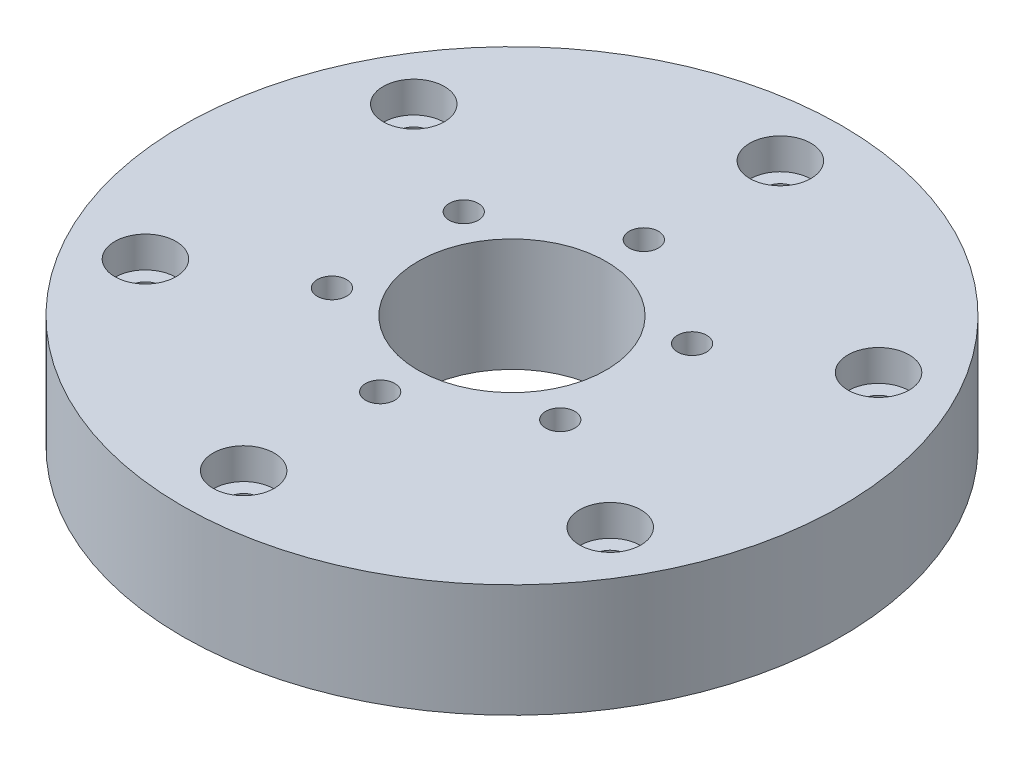
ISO-10303-21;
HEADER;
FILE_DESCRIPTION(('STEP AP214'),'2;1');
FILE_NAME('part.step','',(''),(''),'','','');
FILE_SCHEMA(('AUTOMOTIVE_DESIGN { 1 0 10303 214 1 1 1 1 }'));
ENDSEC;
DATA;
#1=APPLICATION_CONTEXT('core data for automotive mechanical design processes');
#2=APPLICATION_PROTOCOL_DEFINITION('international standard','automotive_design',2000,#1);
#3=PRODUCT_CONTEXT('',#1,'mechanical');
#4=PRODUCT('Part','Part','',(#3));
#5=PRODUCT_RELATED_PRODUCT_CATEGORY('part','',(#4));
#6=PRODUCT_DEFINITION_FORMATION('','',#4);
#7=PRODUCT_DEFINITION_CONTEXT('part definition',#1,'design');
#8=PRODUCT_DEFINITION('design','',#6,#7);
#9=PRODUCT_DEFINITION_SHAPE('','',#8);
#10=(LENGTH_UNIT() NAMED_UNIT(*) SI_UNIT(.MILLI.,.METRE.));
#11=(NAMED_UNIT(*) PLANE_ANGLE_UNIT() SI_UNIT($,.RADIAN.));
#12=(NAMED_UNIT(*) SI_UNIT($,.STERADIAN.) SOLID_ANGLE_UNIT());
#13=UNCERTAINTY_MEASURE_WITH_UNIT(LENGTH_MEASURE(1.E-05),#10,'distance_accuracy_value','');
#14=(GEOMETRIC_REPRESENTATION_CONTEXT(3) GLOBAL_UNCERTAINTY_ASSIGNED_CONTEXT((#13)) GLOBAL_UNIT_ASSIGNED_CONTEXT((#10,
#11,#12)) REPRESENTATION_CONTEXT('',''));
#15=CARTESIAN_POINT('',(0.,0.,0.));
#16=DIRECTION('',(0.,0.,1.));
#17=DIRECTION('',(1.,0.,0.));
#18=AXIS2_PLACEMENT_3D('',#15,#16,#17);
#19=CARTESIAN_POINT('',(0.,12.,-28.5));
#20=DIRECTION('',(0.,-1.,0.));
#21=DIRECTION('',(0.,0.,-1.));
#22=AXIS2_PLACEMENT_3D('',#19,#20,#21);
#23=CYLINDRICAL_SURFACE('',#22,1.7);
#24=CARTESIAN_POINT('',(0.,0.,-28.5));
#25=DIRECTION('',(0.,1.,0.));
#26=DIRECTION('',(0.,0.,1.));
#27=AXIS2_PLACEMENT_3D('',#24,#25,#26);
#28=CIRCLE('',#27,1.7);
#29=CARTESIAN_POINT('',(0.,0.,-26.8));
#30=VERTEX_POINT('',#29);
#31=EDGE_CURVE('E146',#30,#30,#28,.T.);
#32=ORIENTED_EDGE('',*,*,#31,.F.);
#33=EDGE_LOOP('',(#32));
#34=FACE_BOUND('',#33,.T.);
#35=CARTESIAN_POINT('',(0.,8.7,-28.5));
#36=DIRECTION('',(0.,1.,0.));
#37=DIRECTION('',(0.,0.,1.));
#38=AXIS2_PLACEMENT_3D('',#35,#36,#37);
#39=CIRCLE('',#38,1.7);
#40=CARTESIAN_POINT('',(0.,8.7,-26.8));
#41=VERTEX_POINT('',#40);
#42=EDGE_CURVE('E41',#41,#41,#39,.T.);
#43=ORIENTED_EDGE('',*,*,#42,.T.);
#44=EDGE_LOOP('',(#43));
#45=FACE_BOUND('',#44,.T.);
#46=ADVANCED_FACE('F37',(#34,#45),#23,.F.);
#47=CARTESIAN_POINT('',(24.6817240078571,12.,-14.2500000000011));
#48=DIRECTION('',(0.,-1.,0.));
#49=DIRECTION('',(0.,0.,-1.));
#50=AXIS2_PLACEMENT_3D('',#47,#48,#49);
#51=CYLINDRICAL_SURFACE('',#50,1.70000000000034);
#52=CARTESIAN_POINT('',(24.6817240078571,0.,-14.2500000000011));
#53=DIRECTION('',(0.,1.,0.));
#54=DIRECTION('',(0.,0.,1.));
#55=AXIS2_PLACEMENT_3D('',#52,#53,#54);
#56=CIRCLE('',#55,1.70000000000034);
#57=CARTESIAN_POINT('',(24.6817240078571,0.,-12.5500000000007));
#58=VERTEX_POINT('',#57);
#59=EDGE_CURVE('E105',#58,#58,#56,.T.);
#60=ORIENTED_EDGE('',*,*,#59,.F.);
#61=EDGE_LOOP('',(#60));
#62=FACE_BOUND('',#61,.T.);
#63=CARTESIAN_POINT('',(24.6817240078571,8.7,-14.2500000000011));
#64=DIRECTION('',(0.,1.,0.));
#65=DIRECTION('',(0.,0.,1.));
#66=AXIS2_PLACEMENT_3D('',#63,#64,#65);
#67=CIRCLE('',#66,1.70000000000034);
#68=CARTESIAN_POINT('',(24.6817240078571,8.7,-12.5500000000007));
#69=VERTEX_POINT('',#68);
#70=EDGE_CURVE('E74',#69,#69,#67,.T.);
#71=ORIENTED_EDGE('',*,*,#70,.T.);
#72=EDGE_LOOP('',(#71));
#73=FACE_BOUND('',#72,.T.);
#74=ADVANCED_FACE('F185',(#62,#73),#51,.F.);
#75=CARTESIAN_POINT('',(24.6817240078583,12.,14.2499999999989));
#76=DIRECTION('',(0.,-1.,0.));
#77=DIRECTION('',(0.,0.,-1.));
#78=AXIS2_PLACEMENT_3D('',#75,#76,#77);
#79=CYLINDRICAL_SURFACE('',#78,1.70000000000156);
#80=CARTESIAN_POINT('',(24.6817240078583,0.,14.2499999999989));
#81=DIRECTION('',(0.,1.,0.));
#82=DIRECTION('',(0.,0.,1.));
#83=AXIS2_PLACEMENT_3D('',#80,#81,#82);
#84=CIRCLE('',#83,1.70000000000156);
#85=CARTESIAN_POINT('',(24.6817240078583,0.,15.9500000000005));
#86=VERTEX_POINT('',#85);
#87=EDGE_CURVE('E101',#86,#86,#84,.T.);
#88=ORIENTED_EDGE('',*,*,#87,.F.);
#89=EDGE_LOOP('',(#88));
#90=FACE_BOUND('',#89,.T.);
#91=CARTESIAN_POINT('',(24.6817240078583,8.7,14.2499999999989));
#92=DIRECTION('',(0.,1.,0.));
#93=DIRECTION('',(0.,0.,1.));
#94=AXIS2_PLACEMENT_3D('',#91,#92,#93);
#95=CIRCLE('',#94,1.70000000000156);
#96=CARTESIAN_POINT('',(24.6817240078583,8.7,15.9500000000005));
#97=VERTEX_POINT('',#96);
#98=EDGE_CURVE('E71',#97,#97,#95,.T.);
#99=ORIENTED_EDGE('',*,*,#98,.T.);
#100=EDGE_LOOP('',(#99));
#101=FACE_BOUND('',#100,.T.);
#102=ADVANCED_FACE('F191',(#90,#101),#79,.F.);
#103=CARTESIAN_POINT('',(2.41958542616683E-12,12.,28.5));
#104=DIRECTION('',(0.,-1.,0.));
#105=DIRECTION('',(0.,0.,-1.));
#106=AXIS2_PLACEMENT_3D('',#103,#104,#105);
#107=CYLINDRICAL_SURFACE('',#106,1.7000000000025);
#108=CARTESIAN_POINT('',(2.41958542616683E-12,0.,28.5));
#109=DIRECTION('',(0.,1.,0.));
#110=DIRECTION('',(0.,0.,1.));
#111=AXIS2_PLACEMENT_3D('',#108,#109,#110);
#112=CIRCLE('',#111,1.7000000000025);
#113=CARTESIAN_POINT('',(2.41958542616683E-12,0.,30.2000000000025));
#114=VERTEX_POINT('',#113);
#115=EDGE_CURVE('E92',#114,#114,#112,.T.);
#116=ORIENTED_EDGE('',*,*,#115,.F.);
#117=EDGE_LOOP('',(#116));
#118=FACE_BOUND('',#117,.T.);
#119=CARTESIAN_POINT('',(2.41958542616683E-12,8.7,28.5));
#120=DIRECTION('',(0.,1.,0.));
#121=DIRECTION('',(0.,0.,1.));
#122=AXIS2_PLACEMENT_3D('',#119,#120,#121);
#123=CIRCLE('',#122,1.7000000000025);
#124=CARTESIAN_POINT('',(2.41958542616683E-12,8.7,30.2000000000025));
#125=VERTEX_POINT('',#124);
#126=EDGE_CURVE('E67',#125,#125,#123,.T.);
#127=ORIENTED_EDGE('',*,*,#126,.T.);
#128=EDGE_LOOP('',(#127));
#129=FACE_BOUND('',#128,.T.);
#130=ADVANCED_FACE('F218',(#118,#129),#107,.F.);
#131=CARTESIAN_POINT('',(-24.6817240078547,12.,14.2500000000011));
#132=DIRECTION('',(0.,-1.,0.));
#133=DIRECTION('',(0.,0.,-1.));
#134=AXIS2_PLACEMENT_3D('',#131,#132,#133);
#135=CYLINDRICAL_SURFACE('',#134,1.7000000000023);
#136=CARTESIAN_POINT('',(-24.6817240078547,0.,14.2500000000011));
#137=DIRECTION('',(0.,1.,0.));
#138=DIRECTION('',(0.,0.,1.));
#139=AXIS2_PLACEMENT_3D('',#136,#137,#138);
#140=CIRCLE('',#139,1.7000000000023);
#141=CARTESIAN_POINT('',(-24.6817240078547,0.,15.9500000000034));
#142=VERTEX_POINT('',#141);
#143=EDGE_CURVE('E86',#142,#142,#140,.T.);
#144=ORIENTED_EDGE('',*,*,#143,.F.);
#145=EDGE_LOOP('',(#144));
#146=FACE_BOUND('',#145,.T.);
#147=CARTESIAN_POINT('',(-24.6817240078547,8.7,14.2500000000011));
#148=DIRECTION('',(0.,1.,0.));
#149=DIRECTION('',(0.,0.,1.));
#150=AXIS2_PLACEMENT_3D('',#147,#148,#149);
#151=CIRCLE('',#150,1.7000000000023);
#152=CARTESIAN_POINT('',(-24.6817240078547,8.7,15.9500000000034));
#153=VERTEX_POINT('',#152);
#154=EDGE_CURVE('E62',#153,#153,#151,.T.);
#155=ORIENTED_EDGE('',*,*,#154,.T.);
#156=EDGE_LOOP('',(#155));
#157=FACE_BOUND('',#156,.T.);
#158=ADVANCED_FACE('F222',(#146,#157),#135,.F.);
#159=CARTESIAN_POINT('',(-24.6817240078559,12.,-14.2499999999989));
#160=DIRECTION('',(0.,-1.,0.));
#161=DIRECTION('',(0.,0.,-1.));
#162=AXIS2_PLACEMENT_3D('',#159,#160,#161);
#163=CYLINDRICAL_SURFACE('',#162,1.70000000000122);
#164=CARTESIAN_POINT('',(-24.6817240078559,0.,-14.2499999999989));
#165=DIRECTION('',(0.,1.,0.));
#166=DIRECTION('',(0.,0.,1.));
#167=AXIS2_PLACEMENT_3D('',#164,#165,#166);
#168=CIRCLE('',#167,1.70000000000122);
#169=CARTESIAN_POINT('',(-24.6817240078559,0.,-12.5499999999977));
#170=VERTEX_POINT('',#169);
#171=EDGE_CURVE('E81',#170,#170,#168,.T.);
#172=ORIENTED_EDGE('',*,*,#171,.F.);
#173=EDGE_LOOP('',(#172));
#174=FACE_BOUND('',#173,.T.);
#175=CARTESIAN_POINT('',(-24.6817240078559,8.7,-14.2499999999989));
#176=DIRECTION('',(0.,1.,0.));
#177=DIRECTION('',(0.,0.,1.));
#178=AXIS2_PLACEMENT_3D('',#175,#176,#177);
#179=CIRCLE('',#178,1.70000000000122);
#180=CARTESIAN_POINT('',(-24.6817240078559,8.7,-12.5499999999977));
#181=VERTEX_POINT('',#180);
#182=EDGE_CURVE('E58',#181,#181,#179,.T.);
#183=ORIENTED_EDGE('',*,*,#182,.T.);
#184=EDGE_LOOP('',(#183));
#185=FACE_BOUND('',#184,.T.);
#186=ADVANCED_FACE('F226',(#174,#185),#163,.F.);
#187=CARTESIAN_POINT('',(0.,12.,0.));
#188=DIRECTION('',(0.,1.,0.));
#189=DIRECTION('',(0.,0.,1.));
#190=AXIS2_PLACEMENT_3D('',#187,#188,#189);
#191=PLANE('',#190);
#192=CARTESIAN_POINT('',(0.,12.,-28.500000000001));
#193=DIRECTION('',(0.,1.,0.));
#194=DIRECTION('',(0.,0.,1.));
#195=AXIS2_PLACEMENT_3D('',#192,#193,#194);
#196=CIRCLE('',#195,3.25);
#197=CARTESIAN_POINT('',(0.,12.,-25.250000000001));
#198=VERTEX_POINT('',#197);
#199=EDGE_CURVE('E284',#198,#198,#196,.T.);
#200=ORIENTED_EDGE('',*,*,#199,.F.);
#201=EDGE_LOOP('',(#200));
#202=FACE_BOUND('',#201,.T.);
#203=CARTESIAN_POINT('',(-24.6817240078568,12.,-14.2499999999995));
#204=DIRECTION('',(0.,1.,0.));
#205=DIRECTION('',(0.,0.,1.));
#206=AXIS2_PLACEMENT_3D('',#203,#204,#205);
#207=CIRCLE('',#206,3.25000000000122);
#208=CARTESIAN_POINT('',(-24.6817240078568,12.,-10.9999999999982));
#209=VERTEX_POINT('',#208);
#210=EDGE_CURVE('E295',#209,#209,#207,.T.);
#211=ORIENTED_EDGE('',*,*,#210,.F.);
#212=EDGE_LOOP('',(#211));
#213=FACE_BOUND('',#212,.T.);
#214=CARTESIAN_POINT('',(-24.6817240078556,12.,14.2500000000016));
#215=DIRECTION('',(0.,1.,0.));
#216=DIRECTION('',(0.,0.,1.));
#217=AXIS2_PLACEMENT_3D('',#214,#215,#216);
#218=CIRCLE('',#217,3.2500000000023);
#219=CARTESIAN_POINT('',(-24.6817240078556,12.,17.5000000000039));
#220=VERTEX_POINT('',#219);
#221=EDGE_CURVE('E95',#220,#220,#218,.T.);
#222=ORIENTED_EDGE('',*,*,#221,.F.);
#223=EDGE_LOOP('',(#222));
#224=FACE_BOUND('',#223,.T.);
#225=CARTESIAN_POINT('',(2.41958542616692E-12,12.,28.500000000001));
#226=DIRECTION('',(0.,1.,0.));
#227=DIRECTION('',(0.,0.,1.));
#228=AXIS2_PLACEMENT_3D('',#225,#226,#227);
#229=CIRCLE('',#228,3.2500000000025);
#230=CARTESIAN_POINT('',(2.41958542616692E-12,12.,31.7500000000036));
#231=VERTEX_POINT('',#230);
#232=EDGE_CURVE('E318',#231,#231,#229,.T.);
#233=ORIENTED_EDGE('',*,*,#232,.F.);
#234=EDGE_LOOP('',(#233));
#235=FACE_BOUND('',#234,.T.);
#236=CARTESIAN_POINT('',(24.6817240078592,12.,14.2499999999995));
#237=DIRECTION('',(0.,1.,0.));
#238=DIRECTION('',(0.,0.,1.));
#239=AXIS2_PLACEMENT_3D('',#236,#237,#238);
#240=CIRCLE('',#239,3.25000000000156);
#241=CARTESIAN_POINT('',(24.6817240078592,12.,17.500000000001));
#242=VERTEX_POINT('',#241);
#243=EDGE_CURVE('E310',#242,#242,#240,.T.);
#244=ORIENTED_EDGE('',*,*,#243,.F.);
#245=EDGE_LOOP('',(#244));
#246=FACE_BOUND('',#245,.T.);
#247=CARTESIAN_POINT('',(24.681724007858,12.,-14.2500000000016));
#248=DIRECTION('',(0.,1.,0.));
#249=DIRECTION('',(0.,0.,1.));
#250=AXIS2_PLACEMENT_3D('',#247,#248,#249);
#251=CIRCLE('',#250,3.25000000000034);
#252=CARTESIAN_POINT('',(24.681724007858,12.,-11.0000000000012));
#253=VERTEX_POINT('',#252);
#254=EDGE_CURVE('E302',#253,#253,#251,.T.);
#255=ORIENTED_EDGE('',*,*,#254,.F.);
#256=EDGE_LOOP('',(#255));
#257=FACE_BOUND('',#256,.T.);
#258=CARTESIAN_POINT('',(-12.1243556529821,12.,-7.00000000000014));
#259=DIRECTION('',(0.,1.,0.));
#260=DIRECTION('',(0.,0.,1.));
#261=AXIS2_PLACEMENT_3D('',#258,#259,#260);
#262=CIRCLE('',#261,1.55);
#263=CARTESIAN_POINT('',(-12.1243556529821,12.,-5.45000000000014));
#264=VERTEX_POINT('',#263);
#265=EDGE_CURVE('E110',#264,#264,#262,.T.);
#266=ORIENTED_EDGE('',*,*,#265,.F.);
#267=EDGE_LOOP('',(#266));
#268=FACE_BOUND('',#267,.T.);
#269=CARTESIAN_POINT('',(7.90664347494893E-13,12.,14.));
#270=DIRECTION('',(0.,1.,0.));
#271=DIRECTION('',(0.,0.,1.));
#272=AXIS2_PLACEMENT_3D('',#269,#270,#271);
#273=CIRCLE('',#272,1.55000000000085);
#274=CARTESIAN_POINT('',(7.90664347494893E-13,12.,15.5500000000008));
#275=VERTEX_POINT('',#274);
#276=EDGE_CURVE('E126',#275,#275,#273,.T.);
#277=ORIENTED_EDGE('',*,*,#276,.F.);
#278=EDGE_LOOP('',(#277));
#279=FACE_BOUND('',#278,.T.);
#280=CARTESIAN_POINT('',(12.1243556529822,12.,-6.99999999999997));
#281=DIRECTION('',(0.,1.,0.));
#282=DIRECTION('',(0.,0.,1.));
#283=AXIS2_PLACEMENT_3D('',#280,#281,#282);
#284=CIRCLE('',#283,1.55);
#285=CARTESIAN_POINT('',(12.1243556529822,12.,-5.44999999999997));
#286=VERTEX_POINT('',#285);
#287=EDGE_CURVE('E142',#286,#286,#284,.T.);
#288=ORIENTED_EDGE('',*,*,#287,.F.);
#289=EDGE_LOOP('',(#288));
#290=FACE_BOUND('',#289,.T.);
#291=CARTESIAN_POINT('',(0.,12.,-14.));
#292=DIRECTION('',(0.,1.,0.));
#293=DIRECTION('',(0.,0.,1.));
#294=AXIS2_PLACEMENT_3D('',#291,#292,#293);
#295=CIRCLE('',#294,1.55);
#296=CARTESIAN_POINT('',(0.,12.,-12.45));
#297=VERTEX_POINT('',#296);
#298=EDGE_CURVE('E154',#297,#297,#295,.T.);
#299=ORIENTED_EDGE('',*,*,#298,.F.);
#300=EDGE_LOOP('',(#299));
#301=FACE_BOUND('',#300,.T.);
#302=CARTESIAN_POINT('',(0.,12.,0.));
#303=DIRECTION('',(0.,1.,0.));
#304=DIRECTION('',(0.,0.,1.));
#305=AXIS2_PLACEMENT_3D('',#302,#303,#304);
#306=CIRCLE('',#305,35.);
#307=CARTESIAN_POINT('',(0.,12.,35.));
#308=VERTEX_POINT('',#307);
#309=EDGE_CURVE('E10',#308,#308,#306,.T.);
#310=ORIENTED_EDGE('',*,*,#309,.T.);
#311=EDGE_LOOP('',(#310));
#312=FACE_BOUND('',#311,.T.);
#313=CARTESIAN_POINT('',(0.,12.,0.));
#314=DIRECTION('',(0.,1.,0.));
#315=DIRECTION('',(0.,0.,1.));
#316=AXIS2_PLACEMENT_3D('',#313,#314,#315);
#317=CIRCLE('',#316,10.);
#318=CARTESIAN_POINT('',(0.,12.,10.));
#319=VERTEX_POINT('',#318);
#320=EDGE_CURVE('E52',#319,#319,#317,.T.);
#321=ORIENTED_EDGE('',*,*,#320,.F.);
#322=EDGE_LOOP('',(#321));
#323=FACE_BOUND('',#322,.T.);
#324=CARTESIAN_POINT('',(12.1243556529821,12.,7.00000000000006));
#325=DIRECTION('',(0.,1.,0.));
#326=DIRECTION('',(0.,0.,1.));
#327=AXIS2_PLACEMENT_3D('',#324,#325,#326);
#328=CIRCLE('',#327,1.55);
#329=CARTESIAN_POINT('',(12.1243556529821,12.,8.55000000000006));
#330=VERTEX_POINT('',#329);
#331=EDGE_CURVE('E134',#330,#330,#328,.T.);
#332=ORIENTED_EDGE('',*,*,#331,.F.);
#333=EDGE_LOOP('',(#332));
#334=FACE_BOUND('',#333,.T.);
#335=CARTESIAN_POINT('',(-12.1243556529815,12.,7.00000000000035));
#336=DIRECTION('',(0.,1.,0.));
#337=DIRECTION('',(0.,0.,1.));
#338=AXIS2_PLACEMENT_3D('',#335,#336,#337);
#339=CIRCLE('',#338,1.5500000000008);
#340=CARTESIAN_POINT('',(-12.1243556529815,12.,8.55000000000115));
#341=VERTEX_POINT('',#340);
#342=EDGE_CURVE('E118',#341,#341,#339,.T.);
#343=ORIENTED_EDGE('',*,*,#342,.F.);
#344=EDGE_LOOP('',(#343));
#345=FACE_BOUND('',#344,.T.);
#346=ADVANCED_FACE('F230',(#202,#213,#224,#235,#246,#257,#268,#279,#290,#301,#312,#323,#334,
#345),#191,.T.);
#347=CARTESIAN_POINT('',(0.,0.,0.));
#348=DIRECTION('',(0.,1.,0.));
#349=DIRECTION('',(0.,0.,1.));
#350=AXIS2_PLACEMENT_3D('',#347,#348,#349);
#351=PLANE('',#350);
#352=CARTESIAN_POINT('',(0.,0.,0.));
#353=DIRECTION('',(0.,1.,0.));
#354=DIRECTION('',(0.,0.,1.));
#355=AXIS2_PLACEMENT_3D('',#352,#353,#354);
#356=CIRCLE('',#355,35.);
#357=CARTESIAN_POINT('',(0.,0.,35.));
#358=VERTEX_POINT('',#357);
#359=EDGE_CURVE('E46',#358,#358,#356,.T.);
#360=ORIENTED_EDGE('',*,*,#359,.F.);
#361=EDGE_LOOP('',(#360));
#362=FACE_BOUND('',#361,.T.);
#363=CARTESIAN_POINT('',(0.,0.,0.));
#364=DIRECTION('',(0.,1.,0.));
#365=DIRECTION('',(0.,0.,1.));
#366=AXIS2_PLACEMENT_3D('',#363,#364,#365);
#367=CIRCLE('',#366,10.);
#368=CARTESIAN_POINT('',(0.,0.,10.));
#369=VERTEX_POINT('',#368);
#370=EDGE_CURVE('E55',#369,#369,#367,.T.);
#371=ORIENTED_EDGE('',*,*,#370,.T.);
#372=EDGE_LOOP('',(#371));
#373=FACE_BOUND('',#372,.T.);
#374=CARTESIAN_POINT('',(0.,0.,-14.));
#375=DIRECTION('',(0.,1.,0.));
#376=DIRECTION('',(0.,0.,1.));
#377=AXIS2_PLACEMENT_3D('',#374,#375,#376);
#378=CIRCLE('',#377,1.55);
#379=CARTESIAN_POINT('',(0.,0.,-12.45));
#380=VERTEX_POINT('',#379);
#381=EDGE_CURVE('E153',#380,#380,#378,.T.);
#382=ORIENTED_EDGE('',*,*,#381,.T.);
#383=EDGE_LOOP('',(#382));
#384=FACE_BOUND('',#383,.T.);
#385=ORIENTED_EDGE('',*,*,#31,.T.);
#386=EDGE_LOOP('',(#385));
#387=FACE_BOUND('',#386,.T.);
#388=CARTESIAN_POINT('',(12.1243556529822,0.,-6.99999999999997));
#389=DIRECTION('',(0.,1.,0.));
#390=DIRECTION('',(0.,0.,1.));
#391=AXIS2_PLACEMENT_3D('',#388,#389,#390);
#392=CIRCLE('',#391,1.55);
#393=CARTESIAN_POINT('',(12.1243556529822,0.,-5.44999999999997));
#394=VERTEX_POINT('',#393);
#395=EDGE_CURVE('E138',#394,#394,#392,.T.);
#396=ORIENTED_EDGE('',*,*,#395,.T.);
#397=EDGE_LOOP('',(#396));
#398=FACE_BOUND('',#397,.T.);
#399=CARTESIAN_POINT('',(12.1243556529821,0.,7.00000000000006));
#400=DIRECTION('',(0.,1.,0.));
#401=DIRECTION('',(0.,0.,1.));
#402=AXIS2_PLACEMENT_3D('',#399,#400,#401);
#403=CIRCLE('',#402,1.55);
#404=CARTESIAN_POINT('',(12.1243556529821,0.,8.55000000000006));
#405=VERTEX_POINT('',#404);
#406=EDGE_CURVE('E130',#405,#405,#403,.T.);
#407=ORIENTED_EDGE('',*,*,#406,.T.);
#408=EDGE_LOOP('',(#407));
#409=FACE_BOUND('',#408,.T.);
#410=CARTESIAN_POINT('',(7.90664347494893E-13,0.,14.));
#411=DIRECTION('',(0.,1.,0.));
#412=DIRECTION('',(0.,0.,1.));
#413=AXIS2_PLACEMENT_3D('',#410,#411,#412);
#414=CIRCLE('',#413,1.55000000000085);
#415=CARTESIAN_POINT('',(7.90664347494893E-13,0.,15.5500000000008));
#416=VERTEX_POINT('',#415);
#417=EDGE_CURVE('E122',#416,#416,#414,.T.);
#418=ORIENTED_EDGE('',*,*,#417,.T.);
#419=EDGE_LOOP('',(#418));
#420=FACE_BOUND('',#419,.T.);
#421=CARTESIAN_POINT('',(-12.1243556529815,0.,7.00000000000035));
#422=DIRECTION('',(0.,1.,0.));
#423=DIRECTION('',(0.,0.,1.));
#424=AXIS2_PLACEMENT_3D('',#421,#422,#423);
#425=CIRCLE('',#424,1.5500000000008);
#426=CARTESIAN_POINT('',(-12.1243556529815,0.,8.55000000000115));
#427=VERTEX_POINT('',#426);
#428=EDGE_CURVE('E114',#427,#427,#425,.T.);
#429=ORIENTED_EDGE('',*,*,#428,.T.);
#430=EDGE_LOOP('',(#429));
#431=FACE_BOUND('',#430,.T.);
#432=CARTESIAN_POINT('',(-12.1243556529821,0.,-7.00000000000014));
#433=DIRECTION('',(0.,1.,0.));
#434=DIRECTION('',(0.,0.,1.));
#435=AXIS2_PLACEMENT_3D('',#432,#433,#434);
#436=CIRCLE('',#435,1.55);
#437=CARTESIAN_POINT('',(-12.1243556529821,0.,-5.45000000000014));
#438=VERTEX_POINT('',#437);
#439=EDGE_CURVE('E109',#438,#438,#436,.T.);
#440=ORIENTED_EDGE('',*,*,#439,.T.);
#441=EDGE_LOOP('',(#440));
#442=FACE_BOUND('',#441,.T.);
#443=ORIENTED_EDGE('',*,*,#59,.T.);
#444=EDGE_LOOP('',(#443));
#445=FACE_BOUND('',#444,.T.);
#446=ORIENTED_EDGE('',*,*,#87,.T.);
#447=EDGE_LOOP('',(#446));
#448=FACE_BOUND('',#447,.T.);
#449=ORIENTED_EDGE('',*,*,#115,.T.);
#450=EDGE_LOOP('',(#449));
#451=FACE_BOUND('',#450,.T.);
#452=ORIENTED_EDGE('',*,*,#143,.T.);
#453=EDGE_LOOP('',(#452));
#454=FACE_BOUND('',#453,.T.);
#455=ORIENTED_EDGE('',*,*,#171,.T.);
#456=EDGE_LOOP('',(#455));
#457=FACE_BOUND('',#456,.T.);
#458=ADVANCED_FACE('F168',(#362,#373,#384,#387,#398,#409,#420,#431,#442,#445,#448,#451,#454,
#457),#351,.F.);
#459=CARTESIAN_POINT('',(0.,12.,0.));
#460=DIRECTION('',(0.,-1.,0.));
#461=DIRECTION('',(0.,0.,-1.));
#462=AXIS2_PLACEMENT_3D('',#459,#460,#461);
#463=CYLINDRICAL_SURFACE('',#462,35.);
#464=ORIENTED_EDGE('',*,*,#309,.F.);
#465=EDGE_LOOP('',(#464));
#466=FACE_BOUND('',#465,.T.);
#467=ORIENTED_EDGE('',*,*,#359,.T.);
#468=EDGE_LOOP('',(#467));
#469=FACE_BOUND('',#468,.T.);
#470=ADVANCED_FACE('F39',(#466,#469),#463,.T.);
#471=CARTESIAN_POINT('',(0.,12.,0.));
#472=DIRECTION('',(0.,-1.,0.));
#473=DIRECTION('',(0.,0.,-1.));
#474=AXIS2_PLACEMENT_3D('',#471,#472,#473);
#475=CYLINDRICAL_SURFACE('',#474,10.);
#476=ORIENTED_EDGE('',*,*,#320,.T.);
#477=EDGE_LOOP('',(#476));
#478=FACE_BOUND('',#477,.T.);
#479=ORIENTED_EDGE('',*,*,#370,.F.);
#480=EDGE_LOOP('',(#479));
#481=FACE_BOUND('',#480,.T.);
#482=ADVANCED_FACE('F171',(#478,#481),#475,.F.);
#483=CARTESIAN_POINT('',(0.,12.,-14.));
#484=DIRECTION('',(0.,-1.,0.));
#485=DIRECTION('',(0.,0.,-1.));
#486=AXIS2_PLACEMENT_3D('',#483,#484,#485);
#487=CYLINDRICAL_SURFACE('',#486,1.55);
#488=ORIENTED_EDGE('',*,*,#298,.T.);
#489=EDGE_LOOP('',(#488));
#490=FACE_BOUND('',#489,.T.);
#491=ORIENTED_EDGE('',*,*,#381,.F.);
#492=EDGE_LOOP('',(#491));
#493=FACE_BOUND('',#492,.T.);
#494=ADVANCED_FACE('F173',(#490,#493),#487,.F.);
#495=CARTESIAN_POINT('',(12.1243556529822,12.,-6.99999999999997));
#496=DIRECTION('',(0.,-1.,0.));
#497=DIRECTION('',(0.,0.,-1.));
#498=AXIS2_PLACEMENT_3D('',#495,#496,#497);
#499=CYLINDRICAL_SURFACE('',#498,1.55);
#500=ORIENTED_EDGE('',*,*,#287,.T.);
#501=EDGE_LOOP('',(#500));
#502=FACE_BOUND('',#501,.T.);
#503=ORIENTED_EDGE('',*,*,#395,.F.);
#504=EDGE_LOOP('',(#503));
#505=FACE_BOUND('',#504,.T.);
#506=ADVANCED_FACE('F179',(#502,#505),#499,.F.);
#507=CARTESIAN_POINT('',(12.1243556529821,12.,7.00000000000006));
#508=DIRECTION('',(0.,-1.,0.));
#509=DIRECTION('',(0.,0.,-1.));
#510=AXIS2_PLACEMENT_3D('',#507,#508,#509);
#511=CYLINDRICAL_SURFACE('',#510,1.55);
#512=ORIENTED_EDGE('',*,*,#331,.T.);
#513=EDGE_LOOP('',(#512));
#514=FACE_BOUND('',#513,.T.);
#515=ORIENTED_EDGE('',*,*,#406,.F.);
#516=EDGE_LOOP('',(#515));
#517=FACE_BOUND('',#516,.T.);
#518=ADVANCED_FACE('F198',(#514,#517),#511,.F.);
#519=CARTESIAN_POINT('',(7.90664347494893E-13,12.,14.));
#520=DIRECTION('',(0.,-1.,0.));
#521=DIRECTION('',(0.,0.,-1.));
#522=AXIS2_PLACEMENT_3D('',#519,#520,#521);
#523=CYLINDRICAL_SURFACE('',#522,1.55000000000085);
#524=ORIENTED_EDGE('',*,*,#276,.T.);
#525=EDGE_LOOP('',(#524));
#526=FACE_BOUND('',#525,.T.);
#527=ORIENTED_EDGE('',*,*,#417,.F.);
#528=EDGE_LOOP('',(#527));
#529=FACE_BOUND('',#528,.T.);
#530=ADVANCED_FACE('F202',(#526,#529),#523,.F.);
#531=CARTESIAN_POINT('',(-12.1243556529815,12.,7.00000000000035));
#532=DIRECTION('',(0.,-1.,0.));
#533=DIRECTION('',(0.,0.,-1.));
#534=AXIS2_PLACEMENT_3D('',#531,#532,#533);
#535=CYLINDRICAL_SURFACE('',#534,1.5500000000008);
#536=ORIENTED_EDGE('',*,*,#342,.T.);
#537=EDGE_LOOP('',(#536));
#538=FACE_BOUND('',#537,.T.);
#539=ORIENTED_EDGE('',*,*,#428,.F.);
#540=EDGE_LOOP('',(#539));
#541=FACE_BOUND('',#540,.T.);
#542=ADVANCED_FACE('F206',(#538,#541),#535,.F.);
#543=CARTESIAN_POINT('',(-12.1243556529821,12.,-7.00000000000014));
#544=DIRECTION('',(0.,-1.,0.));
#545=DIRECTION('',(0.,0.,-1.));
#546=AXIS2_PLACEMENT_3D('',#543,#544,#545);
#547=CYLINDRICAL_SURFACE('',#546,1.55);
#548=ORIENTED_EDGE('',*,*,#265,.T.);
#549=EDGE_LOOP('',(#548));
#550=FACE_BOUND('',#549,.T.);
#551=ORIENTED_EDGE('',*,*,#439,.F.);
#552=EDGE_LOOP('',(#551));
#553=FACE_BOUND('',#552,.T.);
#554=ADVANCED_FACE('F210',(#550,#553),#547,.F.);
#555=CARTESIAN_POINT('',(-24.6817240078568,8.7,-14.2499999999995));
#556=DIRECTION('',(0.,1.,0.));
#557=DIRECTION('',(0.,0.,1.));
#558=AXIS2_PLACEMENT_3D('',#555,#556,#557);
#559=CYLINDRICAL_SURFACE('',#558,3.25000000000122);
#560=CARTESIAN_POINT('',(-24.6817240078568,8.7,-14.2499999999995));
#561=DIRECTION('',(0.,1.,0.));
#562=DIRECTION('',(0.,0.,1.));
#563=AXIS2_PLACEMENT_3D('',#560,#561,#562);
#564=CIRCLE('',#563,3.25000000000122);
#565=CARTESIAN_POINT('',(-24.6817240078568,8.7,-10.9999999999982));
#566=VERTEX_POINT('',#565);
#567=EDGE_CURVE('E291',#566,#566,#564,.T.);
#568=ORIENTED_EDGE('',*,*,#567,.F.);
#569=EDGE_LOOP('',(#568));
#570=FACE_BOUND('',#569,.T.);
#571=ORIENTED_EDGE('',*,*,#210,.T.);
#572=EDGE_LOOP('',(#571));
#573=FACE_BOUND('',#572,.T.);
#574=ADVANCED_FACE('F213',(#570,#573),#559,.F.);
#575=CARTESIAN_POINT('',(-24.6817240078568,8.7,-14.2499999999995));
#576=DIRECTION('',(0.,1.,0.));
#577=DIRECTION('',(0.,0.,1.));
#578=AXIS2_PLACEMENT_3D('',#575,#576,#577);
#579=PLANE('',#578);
#580=ORIENTED_EDGE('',*,*,#182,.F.);
#581=EDGE_LOOP('',(#580));
#582=FACE_BOUND('',#581,.T.);
#583=ORIENTED_EDGE('',*,*,#567,.T.);
#584=EDGE_LOOP('',(#583));
#585=FACE_BOUND('',#584,.T.);
#586=ADVANCED_FACE('F236',(#582,#585),#579,.T.);
#587=CARTESIAN_POINT('',(-24.6817240078556,8.7,14.2500000000016));
#588=DIRECTION('',(0.,1.,0.));
#589=DIRECTION('',(0.,0.,1.));
#590=AXIS2_PLACEMENT_3D('',#587,#588,#589);
#591=CYLINDRICAL_SURFACE('',#590,3.2500000000023);
#592=CARTESIAN_POINT('',(-24.6817240078556,8.7,14.2500000000016));
#593=DIRECTION('',(0.,1.,0.));
#594=DIRECTION('',(0.,0.,1.));
#595=AXIS2_PLACEMENT_3D('',#592,#593,#594);
#596=CIRCLE('',#595,3.2500000000023);
#597=CARTESIAN_POINT('',(-24.6817240078556,8.7,17.5000000000039));
#598=VERTEX_POINT('',#597);
#599=EDGE_CURVE('E321',#598,#598,#596,.T.);
#600=ORIENTED_EDGE('',*,*,#599,.F.);
#601=EDGE_LOOP('',(#600));
#602=FACE_BOUND('',#601,.T.);
#603=ORIENTED_EDGE('',*,*,#221,.T.);
#604=EDGE_LOOP('',(#603));
#605=FACE_BOUND('',#604,.T.);
#606=ADVANCED_FACE('F232',(#602,#605),#591,.F.);
#607=CARTESIAN_POINT('',(-24.6817240078556,8.7,14.2500000000016));
#608=DIRECTION('',(0.,1.,0.));
#609=DIRECTION('',(0.,0.,1.));
#610=AXIS2_PLACEMENT_3D('',#607,#608,#609);
#611=PLANE('',#610);
#612=ORIENTED_EDGE('',*,*,#154,.F.);
#613=EDGE_LOOP('',(#612));
#614=FACE_BOUND('',#613,.T.);
#615=ORIENTED_EDGE('',*,*,#599,.T.);
#616=EDGE_LOOP('',(#615));
#617=FACE_BOUND('',#616,.T.);
#618=ADVANCED_FACE('F235',(#614,#617),#611,.T.);
#619=CARTESIAN_POINT('',(2.41958542616692E-12,8.7,28.500000000001));
#620=DIRECTION('',(0.,1.,0.));
#621=DIRECTION('',(0.,0.,1.));
#622=AXIS2_PLACEMENT_3D('',#619,#620,#621);
#623=CYLINDRICAL_SURFACE('',#622,3.2500000000025);
#624=CARTESIAN_POINT('',(2.41958542616692E-12,8.7,28.500000000001));
#625=DIRECTION('',(0.,1.,0.));
#626=DIRECTION('',(0.,0.,1.));
#627=AXIS2_PLACEMENT_3D('',#624,#625,#626);
#628=CIRCLE('',#627,3.2500000000025);
#629=CARTESIAN_POINT('',(2.41958542616692E-12,8.7,31.7500000000036));
#630=VERTEX_POINT('',#629);
#631=EDGE_CURVE('E314',#630,#630,#628,.T.);
#632=ORIENTED_EDGE('',*,*,#631,.F.);
#633=EDGE_LOOP('',(#632));
#634=FACE_BOUND('',#633,.T.);
#635=ORIENTED_EDGE('',*,*,#232,.T.);
#636=EDGE_LOOP('',(#635));
#637=FACE_BOUND('',#636,.T.);
#638=ADVANCED_FACE('F240',(#634,#637),#623,.F.);
#639=CARTESIAN_POINT('',(2.41958542616692E-12,8.7,28.500000000001));
#640=DIRECTION('',(0.,1.,0.));
#641=DIRECTION('',(0.,0.,1.));
#642=AXIS2_PLACEMENT_3D('',#639,#640,#641);
#643=PLANE('',#642);
#644=ORIENTED_EDGE('',*,*,#126,.F.);
#645=EDGE_LOOP('',(#644));
#646=FACE_BOUND('',#645,.T.);
#647=ORIENTED_EDGE('',*,*,#631,.T.);
#648=EDGE_LOOP('',(#647));
#649=FACE_BOUND('',#648,.T.);
#650=ADVANCED_FACE('F244',(#646,#649),#643,.T.);
#651=CARTESIAN_POINT('',(24.6817240078592,8.7,14.2499999999995));
#652=DIRECTION('',(0.,1.,0.));
#653=DIRECTION('',(0.,0.,1.));
#654=AXIS2_PLACEMENT_3D('',#651,#652,#653);
#655=CYLINDRICAL_SURFACE('',#654,3.25000000000156);
#656=CARTESIAN_POINT('',(24.6817240078592,8.7,14.2499999999995));
#657=DIRECTION('',(0.,1.,0.));
#658=DIRECTION('',(0.,0.,1.));
#659=AXIS2_PLACEMENT_3D('',#656,#657,#658);
#660=CIRCLE('',#659,3.25000000000156);
#661=CARTESIAN_POINT('',(24.6817240078592,8.7,17.500000000001));
#662=VERTEX_POINT('',#661);
#663=EDGE_CURVE('E306',#662,#662,#660,.T.);
#664=ORIENTED_EDGE('',*,*,#663,.F.);
#665=EDGE_LOOP('',(#664));
#666=FACE_BOUND('',#665,.T.);
#667=ORIENTED_EDGE('',*,*,#243,.T.);
#668=EDGE_LOOP('',(#667));
#669=FACE_BOUND('',#668,.T.);
#670=ADVANCED_FACE('F248',(#666,#669),#655,.F.);
#671=CARTESIAN_POINT('',(24.6817240078592,8.7,14.2499999999995));
#672=DIRECTION('',(0.,1.,0.));
#673=DIRECTION('',(0.,0.,1.));
#674=AXIS2_PLACEMENT_3D('',#671,#672,#673);
#675=PLANE('',#674);
#676=ORIENTED_EDGE('',*,*,#98,.F.);
#677=EDGE_LOOP('',(#676));
#678=FACE_BOUND('',#677,.T.);
#679=ORIENTED_EDGE('',*,*,#663,.T.);
#680=EDGE_LOOP('',(#679));
#681=FACE_BOUND('',#680,.T.);
#682=ADVANCED_FACE('F252',(#678,#681),#675,.T.);
#683=CARTESIAN_POINT('',(24.681724007858,8.7,-14.2500000000016));
#684=DIRECTION('',(0.,1.,0.));
#685=DIRECTION('',(0.,0.,1.));
#686=AXIS2_PLACEMENT_3D('',#683,#684,#685);
#687=CYLINDRICAL_SURFACE('',#686,3.25000000000034);
#688=CARTESIAN_POINT('',(24.681724007858,8.7,-14.2500000000016));
#689=DIRECTION('',(0.,1.,0.));
#690=DIRECTION('',(0.,0.,1.));
#691=AXIS2_PLACEMENT_3D('',#688,#689,#690);
#692=CIRCLE('',#691,3.25000000000034);
#693=CARTESIAN_POINT('',(24.681724007858,8.7,-11.0000000000012));
#694=VERTEX_POINT('',#693);
#695=EDGE_CURVE('E288',#694,#694,#692,.T.);
#696=ORIENTED_EDGE('',*,*,#695,.F.);
#697=EDGE_LOOP('',(#696));
#698=FACE_BOUND('',#697,.T.);
#699=ORIENTED_EDGE('',*,*,#254,.T.);
#700=EDGE_LOOP('',(#699));
#701=FACE_BOUND('',#700,.T.);
#702=ADVANCED_FACE('F256',(#698,#701),#687,.F.);
#703=CARTESIAN_POINT('',(24.681724007858,8.7,-14.2500000000016));
#704=DIRECTION('',(0.,1.,0.));
#705=DIRECTION('',(0.,0.,1.));
#706=AXIS2_PLACEMENT_3D('',#703,#704,#705);
#707=PLANE('',#706);
#708=ORIENTED_EDGE('',*,*,#70,.F.);
#709=EDGE_LOOP('',(#708));
#710=FACE_BOUND('',#709,.T.);
#711=ORIENTED_EDGE('',*,*,#695,.T.);
#712=EDGE_LOOP('',(#711));
#713=FACE_BOUND('',#712,.T.);
#714=ADVANCED_FACE('F260',(#710,#713),#707,.T.);
#715=CARTESIAN_POINT('',(0.,8.7,-28.500000000001));
#716=DIRECTION('',(0.,1.,0.));
#717=DIRECTION('',(0.,0.,1.));
#718=AXIS2_PLACEMENT_3D('',#715,#716,#717);
#719=CYLINDRICAL_SURFACE('',#718,3.25);
#720=CARTESIAN_POINT('',(0.,8.7,-28.500000000001));
#721=DIRECTION('',(0.,1.,0.));
#722=DIRECTION('',(0.,0.,1.));
#723=AXIS2_PLACEMENT_3D('',#720,#721,#722);
#724=CIRCLE('',#723,3.25);
#725=CARTESIAN_POINT('',(0.,8.7,-25.250000000001));
#726=VERTEX_POINT('',#725);
#727=EDGE_CURVE('E63',#726,#726,#724,.T.);
#728=ORIENTED_EDGE('',*,*,#727,.F.);
#729=EDGE_LOOP('',(#728));
#730=FACE_BOUND('',#729,.T.);
#731=ORIENTED_EDGE('',*,*,#199,.T.);
#732=EDGE_LOOP('',(#731));
#733=FACE_BOUND('',#732,.T.);
#734=ADVANCED_FACE('F264',(#730,#733),#719,.F.);
#735=CARTESIAN_POINT('',(0.,8.7,-28.500000000001));
#736=DIRECTION('',(0.,1.,0.));
#737=DIRECTION('',(0.,0.,1.));
#738=AXIS2_PLACEMENT_3D('',#735,#736,#737);
#739=PLANE('',#738);
#740=ORIENTED_EDGE('',*,*,#42,.F.);
#741=EDGE_LOOP('',(#740));
#742=FACE_BOUND('',#741,.T.);
#743=ORIENTED_EDGE('',*,*,#727,.T.);
#744=EDGE_LOOP('',(#743));
#745=FACE_BOUND('',#744,.T.);
#746=ADVANCED_FACE('F274',(#742,#745),#739,.T.);
#747=CLOSED_SHELL('',(#46,#74,#102,#130,#158,#186,#346,#458,#470,#482,#494,#506,#518,#530,#542,
#554,#574,#586,#606,#618,#638,#650,#670,#682,#702,#714,#734,#746));
#748=MANIFOLD_SOLID_BREP('B2',#747);
#749=ADVANCED_BREP_SHAPE_REPRESENTATION('',(#18,#748),#14);
#750=SHAPE_DEFINITION_REPRESENTATION(#9,#749);
ENDSEC;
END-ISO-10303-21;
